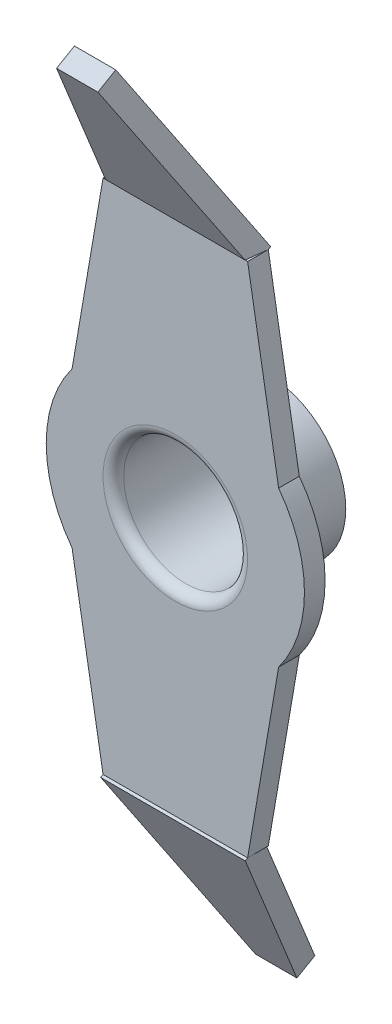
ISO-10303-21;
HEADER;
FILE_DESCRIPTION(('STEP AP214'),'2;1');
FILE_NAME('part.step','',(''),(''),'','','');
FILE_SCHEMA(('AUTOMOTIVE_DESIGN { 1 0 10303 214 1 1 1 1 }'));
ENDSEC;
DATA;
#1=APPLICATION_CONTEXT('core data for automotive mechanical design processes');
#2=APPLICATION_PROTOCOL_DEFINITION('international standard','automotive_design',2000,#1);
#3=PRODUCT_CONTEXT('',#1,'mechanical');
#4=PRODUCT('Part','Part','',(#3));
#5=PRODUCT_RELATED_PRODUCT_CATEGORY('part','',(#4));
#6=PRODUCT_DEFINITION_FORMATION('','',#4);
#7=PRODUCT_DEFINITION_CONTEXT('part definition',#1,'design');
#8=PRODUCT_DEFINITION('design','',#6,#7);
#9=PRODUCT_DEFINITION_SHAPE('','',#8);
#10=(LENGTH_UNIT() NAMED_UNIT(*) SI_UNIT(.MILLI.,.METRE.));
#11=(NAMED_UNIT(*) PLANE_ANGLE_UNIT() SI_UNIT($,.RADIAN.));
#12=(NAMED_UNIT(*) SI_UNIT($,.STERADIAN.) SOLID_ANGLE_UNIT());
#13=UNCERTAINTY_MEASURE_WITH_UNIT(LENGTH_MEASURE(1.E-05),#10,'distance_accuracy_value','');
#14=(GEOMETRIC_REPRESENTATION_CONTEXT(3) GLOBAL_UNCERTAINTY_ASSIGNED_CONTEXT((#13)) GLOBAL_UNIT_ASSIGNED_CONTEXT((#10,
#11,#12)) REPRESENTATION_CONTEXT('',''));
#15=CARTESIAN_POINT('',(0.,0.,0.));
#16=DIRECTION('',(0.,0.,1.));
#17=DIRECTION('',(1.,0.,0.));
#18=AXIS2_PLACEMENT_3D('',#15,#16,#17);
#19=CARTESIAN_POINT('',(-7.,-25.,9.));
#20=DIRECTION('',(0.,1.,0.));
#21=DIRECTION('',(0.,0.,1.));
#22=AXIS2_PLACEMENT_3D('',#19,#20,#21);
#23=PLANE('',#22);
#24=DIRECTION('',(0.124034734589208,0.,-0.992277876713668));
#25=VECTOR('',#24,1.);
#26=CARTESIAN_POINT('',(-7.00000000000001,-25.,9.));
#27=LINE('',#26,#25);
#28=CARTESIAN_POINT('',(-7.,-25.,9.));
#29=VERTEX_POINT('',#28);
#30=CARTESIAN_POINT('',(-6.75000000000001,-25.,7.));
#31=VERTEX_POINT('',#30);
#32=EDGE_CURVE('E11',#29,#31,#27,.T.);
#33=ORIENTED_EDGE('',*,*,#32,.F.);
#34=DIRECTION('',(0.,0.,-1.));
#35=VECTOR('',#34,1.);
#36=CARTESIAN_POINT('',(-7.,-25.,9.));
#37=LINE('',#36,#35);
#38=CARTESIAN_POINT('',(-7.,-25.,7.));
#39=VERTEX_POINT('',#38);
#40=EDGE_CURVE('E255',#29,#39,#37,.T.);
#41=ORIENTED_EDGE('',*,*,#40,.T.);
#42=DIRECTION('',(1.,0.,0.));
#43=VECTOR('',#42,1.);
#44=CARTESIAN_POINT('',(-7.,-25.,7.));
#45=LINE('',#44,#43);
#46=EDGE_CURVE('E208',#39,#31,#45,.T.);
#47=ORIENTED_EDGE('',*,*,#46,.T.);
#48=EDGE_LOOP('',(#33,#41,#47));
#49=FACE_BOUND('',#48,.T.);
#50=ADVANCED_FACE('F32',(#49),#23,.F.);
#51=DIRECTION('',(0.124034734589208,0.,0.992277876713668));
#52=VECTOR('',#51,1.);
#53=CARTESIAN_POINT('',(6.78461538461539,-25.,7.27692307692308));
#54=LINE('',#53,#52);
#55=CARTESIAN_POINT('',(6.75,-25.,6.99999999999999));
#56=VERTEX_POINT('',#55);
#57=CARTESIAN_POINT('',(7.,-25.,9.));
#58=VERTEX_POINT('',#57);
#59=EDGE_CURVE('E40',#56,#58,#54,.T.);
#60=ORIENTED_EDGE('',*,*,#59,.F.);
#61=CARTESIAN_POINT('',(6.99999999999999,-25.,7.));
#62=VERTEX_POINT('',#61);
#63=EDGE_CURVE('E207',#56,#62,#45,.T.);
#64=ORIENTED_EDGE('',*,*,#63,.T.);
#65=DIRECTION('',(0.,0.,-1.));
#66=VECTOR('',#65,1.);
#67=CARTESIAN_POINT('',(7.,-25.,9.));
#68=LINE('',#67,#66);
#69=EDGE_CURVE('E252',#58,#62,#68,.T.);
#70=ORIENTED_EDGE('',*,*,#69,.F.);
#71=EDGE_LOOP('',(#60,#64,#70));
#72=FACE_BOUND('',#71,.T.);
#73=ADVANCED_FACE('F317',(#72),#23,.F.);
#74=CARTESIAN_POINT('',(-7.,25.,9.));
#75=DIRECTION('',(0.,-1.,0.));
#76=DIRECTION('',(0.,0.,-1.));
#77=AXIS2_PLACEMENT_3D('',#74,#75,#76);
#78=PLANE('',#77);
#79=DIRECTION('',(0.124034734589208,0.,0.992277876713668));
#80=VECTOR('',#79,1.);
#81=CARTESIAN_POINT('',(-6.75384615384616,25.,8.96923076923076));
#82=LINE('',#81,#80);
#83=CARTESIAN_POINT('',(-7.,25.,7.00000000000002));
#84=VERTEX_POINT('',#83);
#85=CARTESIAN_POINT('',(-6.75,25.,9.));
#86=VERTEX_POINT('',#85);
#87=EDGE_CURVE('E281',#84,#86,#82,.T.);
#88=ORIENTED_EDGE('',*,*,#87,.F.);
#89=DIRECTION('',(0.,0.,-1.));
#90=VECTOR('',#89,1.);
#91=CARTESIAN_POINT('',(-7.,25.,9.));
#92=LINE('',#91,#90);
#93=CARTESIAN_POINT('',(-7.,25.,9.));
#94=VERTEX_POINT('',#93);
#95=EDGE_CURVE('E239',#94,#84,#92,.T.);
#96=ORIENTED_EDGE('',*,*,#95,.F.);
#97=DIRECTION('',(-1.,0.,0.));
#98=VECTOR('',#97,1.);
#99=CARTESIAN_POINT('',(-7.,25.,9.));
#100=LINE('',#99,#98);
#101=EDGE_CURVE('E235',#86,#94,#100,.T.);
#102=ORIENTED_EDGE('',*,*,#101,.F.);
#103=EDGE_LOOP('',(#88,#96,#102));
#104=FACE_BOUND('',#103,.T.);
#105=ADVANCED_FACE('F323',(#104),#78,.F.);
#106=DIRECTION('',(0.124034734589208,0.,-0.992277876713668));
#107=VECTOR('',#106,1.);
#108=CARTESIAN_POINT('',(6.53846153846154,25.,10.6923076923077));
#109=LINE('',#108,#107);
#110=CARTESIAN_POINT('',(6.75,25.,9.));
#111=VERTEX_POINT('',#110);
#112=CARTESIAN_POINT('',(7.,25.,7.));
#113=VERTEX_POINT('',#112);
#114=EDGE_CURVE('E279',#111,#113,#109,.T.);
#115=ORIENTED_EDGE('',*,*,#114,.F.);
#116=CARTESIAN_POINT('',(7.,25.,9.));
#117=VERTEX_POINT('',#116);
#118=EDGE_CURVE('E236',#117,#111,#100,.T.);
#119=ORIENTED_EDGE('',*,*,#118,.F.);
#120=DIRECTION('',(0.,0.,-1.));
#121=VECTOR('',#120,1.);
#122=CARTESIAN_POINT('',(7.,25.,9.));
#123=LINE('',#122,#121);
#124=EDGE_CURVE('E243',#117,#113,#123,.T.);
#125=ORIENTED_EDGE('',*,*,#124,.T.);
#126=EDGE_LOOP('',(#115,#119,#125));
#127=FACE_BOUND('',#126,.T.);
#128=ADVANCED_FACE('F347',(#127),#78,.F.);
#129=CARTESIAN_POINT('',(0.,0.,0.));
#130=DIRECTION('',(0.,0.,1.));
#131=DIRECTION('',(1.,0.,0.));
#132=AXIS2_PLACEMENT_3D('',#129,#130,#131);
#133=PLANE('',#132);
#134=CARTESIAN_POINT('',(0.,0.,0.));
#135=DIRECTION('',(0.,0.,1.));
#136=DIRECTION('',(1.,0.,0.));
#137=AXIS2_PLACEMENT_3D('',#134,#135,#136);
#138=CIRCLE('',#137,7.5);
#139=CARTESIAN_POINT('',(7.5,0.,0.));
#140=VERTEX_POINT('',#139);
#141=EDGE_CURVE('E267',#140,#140,#138,.T.);
#142=ORIENTED_EDGE('',*,*,#141,.F.);
#143=EDGE_LOOP('',(#142));
#144=FACE_BOUND('',#143,.T.);
#145=CARTESIAN_POINT('',(0.,0.,0.));
#146=DIRECTION('',(0.,0.,1.));
#147=DIRECTION('',(1.,0.,0.));
#148=AXIS2_PLACEMENT_3D('',#145,#146,#147);
#149=CIRCLE('',#148,6.);
#150=CARTESIAN_POINT('',(6.,0.,0.));
#151=VERTEX_POINT('',#150);
#152=EDGE_CURVE('E264',#151,#151,#149,.T.);
#153=ORIENTED_EDGE('',*,*,#152,.T.);
#154=EDGE_LOOP('',(#153));
#155=FACE_BOUND('',#154,.T.);
#156=ADVANCED_FACE('F345',(#144,#155),#133,.F.);
#157=CARTESIAN_POINT('',(0.,0.,6.99999999999999));
#158=DIRECTION('',(0.,0.,-1.));
#159=DIRECTION('',(-1.,0.,0.));
#160=AXIS2_PLACEMENT_3D('',#157,#158,#159);
#161=CYLINDRICAL_SURFACE('',#160,7.5);
#162=CARTESIAN_POINT('',(0.,0.,6.99999999999999));
#163=DIRECTION('',(0.,0.,1.));
#164=DIRECTION('',(1.,0.,0.));
#165=AXIS2_PLACEMENT_3D('',#162,#163,#164);
#166=CIRCLE('',#165,7.5);
#167=CARTESIAN_POINT('',(7.5,0.,6.99999999999999));
#168=VERTEX_POINT('',#167);
#169=EDGE_CURVE('E270',#168,#168,#166,.T.);
#170=ORIENTED_EDGE('',*,*,#169,.F.);
#171=EDGE_LOOP('',(#170));
#172=FACE_BOUND('',#171,.T.);
#173=ORIENTED_EDGE('',*,*,#141,.T.);
#174=EDGE_LOOP('',(#173));
#175=FACE_BOUND('',#174,.T.);
#176=ADVANCED_FACE('F34',(#172,#175),#161,.T.);
#177=CARTESIAN_POINT('',(0.,0.,6.99999999999999));
#178=DIRECTION('',(0.,0.,-1.));
#179=DIRECTION('',(-1.,0.,0.));
#180=AXIS2_PLACEMENT_3D('',#177,#178,#179);
#181=CYLINDRICAL_SURFACE('',#180,6.);
#182=CARTESIAN_POINT('',(0.,0.,7.99999999999999));
#183=DIRECTION('',(0.,0.,1.));
#184=DIRECTION('',(1.,0.,0.));
#185=AXIS2_PLACEMENT_3D('',#182,#183,#184);
#186=CIRCLE('',#185,6.);
#187=CARTESIAN_POINT('',(6.,0.,7.99999999999999));
#188=VERTEX_POINT('',#187);
#189=EDGE_CURVE('E273',#188,#188,#186,.T.);
#190=ORIENTED_EDGE('',*,*,#189,.T.);
#191=EDGE_LOOP('',(#190));
#192=FACE_BOUND('',#191,.T.);
#193=ORIENTED_EDGE('',*,*,#152,.F.);
#194=EDGE_LOOP('',(#193));
#195=FACE_BOUND('',#194,.T.);
#196=ADVANCED_FACE('F341',(#192,#195),#181,.F.);
#197=CARTESIAN_POINT('',(0.,0.,6.99999999999999));
#198=DIRECTION('',(0.,0.,1.));
#199=DIRECTION('',(1.,0.,0.));
#200=AXIS2_PLACEMENT_3D('',#197,#198,#199);
#201=PLANE('',#200);
#202=DIRECTION('',(-0.168963815110846,-0.985622254813266,0.));
#203=VECTOR('',#202,1.);
#204=CARTESIAN_POINT('',(-7.,25.,7.));
#205=LINE('',#204,#203);
#206=CARTESIAN_POINT('',(-9.99999999999999,7.5,7.));
#207=VERTEX_POINT('',#206);
#208=EDGE_CURVE('E200',#84,#207,#205,.T.);
#209=ORIENTED_EDGE('',*,*,#208,.F.);
#210=DIRECTION('',(-1.,0.,0.));
#211=VECTOR('',#210,1.);
#212=CARTESIAN_POINT('',(-7.,25.,7.));
#213=LINE('',#212,#211);
#214=EDGE_CURVE('E217',#113,#84,#213,.T.);
#215=ORIENTED_EDGE('',*,*,#214,.F.);
#216=DIRECTION('',(-0.168963815110846,0.985622254813266,0.));
#217=VECTOR('',#216,1.);
#218=CARTESIAN_POINT('',(7.,25.,7.));
#219=LINE('',#218,#217);
#220=CARTESIAN_POINT('',(10.,7.5,7.));
#221=VERTEX_POINT('',#220);
#222=EDGE_CURVE('E214',#221,#113,#219,.T.);
#223=ORIENTED_EDGE('',*,*,#222,.F.);
#224=CARTESIAN_POINT('',(0.,0.,6.99999999999999));
#225=DIRECTION('',(0.,0.,1.));
#226=DIRECTION('',(1.,0.,0.));
#227=AXIS2_PLACEMENT_3D('',#224,#225,#226);
#228=CIRCLE('',#227,12.5);
#229=CARTESIAN_POINT('',(10.,-7.5,7.));
#230=VERTEX_POINT('',#229);
#231=EDGE_CURVE('E212',#230,#221,#228,.T.);
#232=ORIENTED_EDGE('',*,*,#231,.F.);
#233=DIRECTION('',(0.168963815110846,0.985622254813266,0.));
#234=VECTOR('',#233,1.);
#235=CARTESIAN_POINT('',(6.99999999999999,-25.,7.));
#236=LINE('',#235,#234);
#237=EDGE_CURVE('E210',#62,#230,#236,.T.);
#238=ORIENTED_EDGE('',*,*,#237,.F.);
#239=ORIENTED_EDGE('',*,*,#63,.F.);
#240=EDGE_CURVE('E47',#31,#56,#45,.T.);
#241=ORIENTED_EDGE('',*,*,#240,.F.);
#242=ORIENTED_EDGE('',*,*,#46,.F.);
#243=DIRECTION('',(0.168963815110846,-0.985622254813267,0.));
#244=VECTOR('',#243,1.);
#245=CARTESIAN_POINT('',(-7.,-25.,7.));
#246=LINE('',#245,#244);
#247=CARTESIAN_POINT('',(-10.,-7.49999999999999,7.));
#248=VERTEX_POINT('',#247);
#249=EDGE_CURVE('E205',#248,#39,#246,.T.);
#250=ORIENTED_EDGE('',*,*,#249,.F.);
#251=CARTESIAN_POINT('',(0.,0.,6.99999999999999));
#252=DIRECTION('',(0.,0.,1.));
#253=DIRECTION('',(1.,0.,0.));
#254=AXIS2_PLACEMENT_3D('',#251,#252,#253);
#255=CIRCLE('',#254,12.5);
#256=EDGE_CURVE('E203',#207,#248,#255,.T.);
#257=ORIENTED_EDGE('',*,*,#256,.F.);
#258=EDGE_LOOP('',(#209,#215,#223,#232,#238,#239,#241,#242,#250,#257));
#259=FACE_BOUND('',#258,.T.);
#260=ORIENTED_EDGE('',*,*,#169,.T.);
#261=EDGE_LOOP('',(#260));
#262=FACE_BOUND('',#261,.T.);
#263=ADVANCED_FACE('F343',(#259,#262),#201,.F.);
#264=CARTESIAN_POINT('',(0.,0.,9.));
#265=DIRECTION('',(0.,0.,1.));
#266=DIRECTION('',(1.,0.,0.));
#267=AXIS2_PLACEMENT_3D('',#264,#265,#266);
#268=PLANE('',#267);
#269=CARTESIAN_POINT('',(0.,0.,9.));
#270=DIRECTION('',(0.,0.,1.));
#271=DIRECTION('',(1.,0.,0.));
#272=AXIS2_PLACEMENT_3D('',#269,#270,#271);
#273=CIRCLE('',#272,7.);
#274=CARTESIAN_POINT('',(7.,0.,9.));
#275=VERTEX_POINT('',#274);
#276=EDGE_CURVE('E276',#275,#275,#273,.F.);
#277=ORIENTED_EDGE('',*,*,#276,.T.);
#278=EDGE_LOOP('',(#277));
#279=FACE_BOUND('',#278,.T.);
#280=DIRECTION('',(-0.168963815110846,-0.985622254813266,0.));
#281=VECTOR('',#280,1.);
#282=CARTESIAN_POINT('',(-7.,25.,9.));
#283=LINE('',#282,#281);
#284=CARTESIAN_POINT('',(-10.,7.5,9.));
#285=VERTEX_POINT('',#284);
#286=EDGE_CURVE('E219',#94,#285,#283,.T.);
#287=ORIENTED_EDGE('',*,*,#286,.T.);
#288=CARTESIAN_POINT('',(0.,0.,9.));
#289=DIRECTION('',(0.,0.,1.));
#290=DIRECTION('',(1.,0.,0.));
#291=AXIS2_PLACEMENT_3D('',#288,#289,#290);
#292=CIRCLE('',#291,12.5);
#293=CARTESIAN_POINT('',(-10.,-7.5,9.));
#294=VERTEX_POINT('',#293);
#295=EDGE_CURVE('E222',#285,#294,#292,.T.);
#296=ORIENTED_EDGE('',*,*,#295,.T.);
#297=DIRECTION('',(0.168963815110846,-0.985622254813267,0.));
#298=VECTOR('',#297,1.);
#299=CARTESIAN_POINT('',(-7.,-25.,9.));
#300=LINE('',#299,#298);
#301=EDGE_CURVE('E224',#294,#29,#300,.T.);
#302=ORIENTED_EDGE('',*,*,#301,.T.);
#303=DIRECTION('',(1.,0.,0.));
#304=VECTOR('',#303,1.);
#305=CARTESIAN_POINT('',(-7.,-25.,9.));
#306=LINE('',#305,#304);
#307=EDGE_CURVE('E227',#29,#58,#306,.T.);
#308=ORIENTED_EDGE('',*,*,#307,.T.);
#309=DIRECTION('',(0.168963815110846,0.985622254813266,0.));
#310=VECTOR('',#309,1.);
#311=CARTESIAN_POINT('',(7.,-25.,9.));
#312=LINE('',#311,#310);
#313=CARTESIAN_POINT('',(9.99999999999999,-7.5,9.));
#314=VERTEX_POINT('',#313);
#315=EDGE_CURVE('E229',#58,#314,#312,.T.);
#316=ORIENTED_EDGE('',*,*,#315,.T.);
#317=CARTESIAN_POINT('',(0.,0.,9.));
#318=DIRECTION('',(0.,0.,1.));
#319=DIRECTION('',(1.,0.,0.));
#320=AXIS2_PLACEMENT_3D('',#317,#318,#319);
#321=CIRCLE('',#320,12.5);
#322=CARTESIAN_POINT('',(10.,7.49999999999999,9.));
#323=VERTEX_POINT('',#322);
#324=EDGE_CURVE('E231',#314,#323,#321,.T.);
#325=ORIENTED_EDGE('',*,*,#324,.T.);
#326=DIRECTION('',(-0.168963815110846,0.985622254813266,0.));
#327=VECTOR('',#326,1.);
#328=CARTESIAN_POINT('',(7.,25.,9.));
#329=LINE('',#328,#327);
#330=EDGE_CURVE('E233',#323,#117,#329,.T.);
#331=ORIENTED_EDGE('',*,*,#330,.T.);
#332=ORIENTED_EDGE('',*,*,#118,.T.);
#333=EDGE_CURVE('E240',#111,#86,#100,.T.);
#334=ORIENTED_EDGE('',*,*,#333,.T.);
#335=ORIENTED_EDGE('',*,*,#101,.T.);
#336=EDGE_LOOP('',(#287,#296,#302,#308,#316,#325,#331,#332,#334,#335));
#337=FACE_BOUND('',#336,.T.);
#338=ADVANCED_FACE('F339',(#279,#337),#268,.T.);
#339=CARTESIAN_POINT('',(-7.,25.,9.));
#340=DIRECTION('',(0.985622254813266,-0.168963815110846,0.));
#341=DIRECTION('',(0.168963815110846,0.985622254813266,0.));
#342=AXIS2_PLACEMENT_3D('',#339,#340,#341);
#343=PLANE('',#342);
#344=ORIENTED_EDGE('',*,*,#208,.T.);
#345=DIRECTION('',(0.,0.,-1.));
#346=VECTOR('',#345,1.);
#347=CARTESIAN_POINT('',(-10.,7.5,9.));
#348=LINE('',#347,#346);
#349=EDGE_CURVE('E261',#285,#207,#348,.T.);
#350=ORIENTED_EDGE('',*,*,#349,.F.);
#351=ORIENTED_EDGE('',*,*,#286,.F.);
#352=ORIENTED_EDGE('',*,*,#95,.T.);
#353=EDGE_LOOP('',(#344,#350,#351,#352));
#354=FACE_BOUND('',#353,.T.);
#355=ADVANCED_FACE('F335',(#354),#343,.F.);
#356=CARTESIAN_POINT('',(0.,0.,9.));
#357=DIRECTION('',(0.,0.,-1.));
#358=DIRECTION('',(-1.,0.,0.));
#359=AXIS2_PLACEMENT_3D('',#356,#357,#358);
#360=CYLINDRICAL_SURFACE('',#359,12.5);
#361=ORIENTED_EDGE('',*,*,#256,.T.);
#362=DIRECTION('',(0.,0.,-1.));
#363=VECTOR('',#362,1.);
#364=CARTESIAN_POINT('',(-10.,-7.5,9.));
#365=LINE('',#364,#363);
#366=EDGE_CURVE('E258',#294,#248,#365,.T.);
#367=ORIENTED_EDGE('',*,*,#366,.F.);
#368=ORIENTED_EDGE('',*,*,#295,.F.);
#369=ORIENTED_EDGE('',*,*,#349,.T.);
#370=EDGE_LOOP('',(#361,#367,#368,#369));
#371=FACE_BOUND('',#370,.T.);
#372=ADVANCED_FACE('F331',(#371),#360,.T.);
#373=CARTESIAN_POINT('',(-7.,-25.,9.));
#374=DIRECTION('',(0.985622254813267,0.168963815110846,0.));
#375=DIRECTION('',(-0.168963815110846,0.985622254813267,0.));
#376=AXIS2_PLACEMENT_3D('',#373,#374,#375);
#377=PLANE('',#376);
#378=ORIENTED_EDGE('',*,*,#249,.T.);
#379=ORIENTED_EDGE('',*,*,#40,.F.);
#380=ORIENTED_EDGE('',*,*,#301,.F.);
#381=ORIENTED_EDGE('',*,*,#366,.T.);
#382=EDGE_LOOP('',(#378,#379,#380,#381));
#383=FACE_BOUND('',#382,.T.);
#384=ADVANCED_FACE('F328',(#383),#377,.F.);
#385=CARTESIAN_POINT('',(7.,-25.,9.));
#386=DIRECTION('',(-0.985622254813266,0.168963815110846,0.));
#387=DIRECTION('',(-0.168963815110846,-0.985622254813266,0.));
#388=AXIS2_PLACEMENT_3D('',#385,#386,#387);
#389=PLANE('',#388);
#390=ORIENTED_EDGE('',*,*,#237,.T.);
#391=DIRECTION('',(0.,0.,-1.));
#392=VECTOR('',#391,1.);
#393=CARTESIAN_POINT('',(9.99999999999999,-7.5,9.));
#394=LINE('',#393,#392);
#395=EDGE_CURVE('E249',#314,#230,#394,.T.);
#396=ORIENTED_EDGE('',*,*,#395,.F.);
#397=ORIENTED_EDGE('',*,*,#315,.F.);
#398=ORIENTED_EDGE('',*,*,#69,.T.);
#399=EDGE_LOOP('',(#390,#396,#397,#398));
#400=FACE_BOUND('',#399,.T.);
#401=ADVANCED_FACE('F326',(#400),#389,.F.);
#402=CARTESIAN_POINT('',(0.,0.,9.));
#403=DIRECTION('',(0.,0.,-1.));
#404=DIRECTION('',(-1.,0.,0.));
#405=AXIS2_PLACEMENT_3D('',#402,#403,#404);
#406=CYLINDRICAL_SURFACE('',#405,12.5);
#407=ORIENTED_EDGE('',*,*,#231,.T.);
#408=DIRECTION('',(0.,0.,-1.));
#409=VECTOR('',#408,1.);
#410=CARTESIAN_POINT('',(10.,7.49999999999999,9.));
#411=LINE('',#410,#409);
#412=EDGE_CURVE('E246',#323,#221,#411,.T.);
#413=ORIENTED_EDGE('',*,*,#412,.F.);
#414=ORIENTED_EDGE('',*,*,#324,.F.);
#415=ORIENTED_EDGE('',*,*,#395,.T.);
#416=EDGE_LOOP('',(#407,#413,#414,#415));
#417=FACE_BOUND('',#416,.T.);
#418=ADVANCED_FACE('F372',(#417),#406,.T.);
#419=CARTESIAN_POINT('',(7.,25.,9.));
#420=DIRECTION('',(-0.985622254813266,-0.168963815110846,0.));
#421=DIRECTION('',(0.168963815110846,-0.985622254813266,0.));
#422=AXIS2_PLACEMENT_3D('',#419,#420,#421);
#423=PLANE('',#422);
#424=ORIENTED_EDGE('',*,*,#222,.T.);
#425=ORIENTED_EDGE('',*,*,#124,.F.);
#426=ORIENTED_EDGE('',*,*,#330,.F.);
#427=ORIENTED_EDGE('',*,*,#412,.T.);
#428=EDGE_LOOP('',(#424,#425,#426,#427));
#429=FACE_BOUND('',#428,.T.);
#430=ADVANCED_FACE('F369',(#429),#423,.F.);
#431=CARTESIAN_POINT('',(0.,0.,7.99999999999999));
#432=DIRECTION('',(0.,0.,1.));
#433=DIRECTION('',(1.,0.,0.));
#434=AXIS2_PLACEMENT_3D('',#431,#432,#433);
#435=TOROIDAL_SURFACE('',#434,7.,1.);
#436=ORIENTED_EDGE('',*,*,#276,.F.);
#437=EDGE_LOOP('',(#436));
#438=FACE_BOUND('',#437,.T.);
#439=ORIENTED_EDGE('',*,*,#189,.F.);
#440=EDGE_LOOP('',(#439));
#441=FACE_BOUND('',#440,.T.);
#442=ADVANCED_FACE('F371',(#438,#441),#435,.T.);
#443=CARTESIAN_POINT('',(7.,25.1339745962156,6.76794919243113));
#444=DIRECTION('',(0.,0.86602540378444,0.499999999999998));
#445=DIRECTION('',(0.,-0.499999999999998,0.86602540378444));
#446=AXIS2_PLACEMENT_3D('',#443,#444,#445);
#447=PLANE('',#446);
#448=DIRECTION('',(0.,-0.499999999999998,0.86602540378444));
#449=VECTOR('',#448,1.);
#450=CARTESIAN_POINT('',(7.,25.1339745962156,6.76794919243113));
#451=LINE('',#450,#449);
#452=CARTESIAN_POINT('',(7.,25.1339745962156,6.76794919243113));
#453=VERTEX_POINT('',#452);
#454=EDGE_CURVE('E188',#453,#113,#451,.T.);
#455=ORIENTED_EDGE('',*,*,#454,.T.);
#456=ORIENTED_EDGE('',*,*,#214,.T.);
#457=DIRECTION('',(0.,-0.499999999999998,0.86602540378444));
#458=VECTOR('',#457,1.);
#459=CARTESIAN_POINT('',(-7.,25.1339745962156,6.76794919243113));
#460=LINE('',#459,#458);
#461=CARTESIAN_POINT('',(-7.,25.1339745962156,6.76794919243113));
#462=VERTEX_POINT('',#461);
#463=EDGE_CURVE('E197',#462,#84,#460,.T.);
#464=ORIENTED_EDGE('',*,*,#463,.F.);
#465=DIRECTION('',(-1.,0.,0.));
#466=VECTOR('',#465,1.);
#467=CARTESIAN_POINT('',(7.,25.1339745962156,6.76794919243113));
#468=LINE('',#467,#466);
#469=EDGE_CURVE('E179',#453,#462,#468,.T.);
#470=ORIENTED_EDGE('',*,*,#469,.F.);
#471=EDGE_LOOP('',(#455,#456,#464,#470));
#472=FACE_BOUND('',#471,.T.);
#473=ADVANCED_FACE('F393',(#472),#447,.F.);
#474=CARTESIAN_POINT('',(-7.,25.1339745962156,6.76794919243113));
#475=DIRECTION('',(0.970142500145332,-0.210042012604202,-0.121267812518166));
#476=DIRECTION('',(0.21160368475758,0.977355554850442,0.));
#477=AXIS2_PLACEMENT_3D('',#474,#475,#476);
#478=PLANE('',#477);
#479=ORIENTED_EDGE('',*,*,#463,.T.);
#480=ORIENTED_EDGE('',*,*,#87,.T.);
#481=DIRECTION('',(0.242535625036333,0.840168050416807,0.485071250072664));
#482=VECTOR('',#481,1.);
#483=CARTESIAN_POINT('',(-7.,24.1339745962156,8.50000000000001));
#484=LINE('',#483,#482);
#485=CARTESIAN_POINT('',(-2.,41.4544826719044,18.5));
#486=VERTEX_POINT('',#485);
#487=EDGE_CURVE('E55',#86,#486,#484,.T.);
#488=ORIENTED_EDGE('',*,*,#487,.T.);
#489=DIRECTION('',(0.,-0.499999999999998,0.86602540378444));
#490=VECTOR('',#489,1.);
#491=CARTESIAN_POINT('',(-2.,42.4544826719044,16.7679491924311));
#492=LINE('',#491,#490);
#493=CARTESIAN_POINT('',(-2.,42.4544826719044,16.7679491924311));
#494=VERTEX_POINT('',#493);
#495=EDGE_CURVE('E194',#494,#486,#492,.T.);
#496=ORIENTED_EDGE('',*,*,#495,.F.);
#497=DIRECTION('',(0.242535625036333,0.840168050416807,0.485071250072664));
#498=VECTOR('',#497,1.);
#499=CARTESIAN_POINT('',(-7.,25.1339745962156,6.76794919243113));
#500=LINE('',#499,#498);
#501=EDGE_CURVE('E182',#462,#494,#500,.T.);
#502=ORIENTED_EDGE('',*,*,#501,.F.);
#503=EDGE_LOOP('',(#479,#480,#488,#496,#502));
#504=FACE_BOUND('',#503,.T.);
#505=ADVANCED_FACE('F398',(#504),#478,.F.);
#506=CARTESIAN_POINT('',(7.,25.1339745962156,6.76794919243113));
#507=DIRECTION('',(-0.970142500145332,-0.210042012604201,-0.121267812518166));
#508=DIRECTION('',(0.21160368475758,-0.977355554850441,0.));
#509=AXIS2_PLACEMENT_3D('',#506,#507,#508);
#510=PLANE('',#509);
#511=DIRECTION('',(0.242535625036333,-0.840168050416807,-0.485071250072664));
#512=VECTOR('',#511,1.);
#513=CARTESIAN_POINT('',(7.,24.1339745962156,8.5));
#514=LINE('',#513,#512);
#515=CARTESIAN_POINT('',(2.,41.4544826719043,18.5));
#516=VERTEX_POINT('',#515);
#517=EDGE_CURVE('E176',#516,#111,#514,.T.);
#518=ORIENTED_EDGE('',*,*,#517,.T.);
#519=ORIENTED_EDGE('',*,*,#114,.T.);
#520=ORIENTED_EDGE('',*,*,#454,.F.);
#521=DIRECTION('',(0.242535625036333,-0.840168050416807,-0.485071250072664));
#522=VECTOR('',#521,1.);
#523=CARTESIAN_POINT('',(7.,25.1339745962156,6.76794919243113));
#524=LINE('',#523,#522);
#525=CARTESIAN_POINT('',(2.,42.4544826719043,16.7679491924311));
#526=VERTEX_POINT('',#525);
#527=EDGE_CURVE('E186',#526,#453,#524,.T.);
#528=ORIENTED_EDGE('',*,*,#527,.F.);
#529=DIRECTION('',(0.,-0.499999999999998,0.86602540378444));
#530=VECTOR('',#529,1.);
#531=CARTESIAN_POINT('',(2.,42.4544826719043,16.7679491924311));
#532=LINE('',#531,#530);
#533=EDGE_CURVE('E191',#526,#516,#532,.T.);
#534=ORIENTED_EDGE('',*,*,#533,.T.);
#535=EDGE_LOOP('',(#518,#519,#520,#528,#534));
#536=FACE_BOUND('',#535,.T.);
#537=ADVANCED_FACE('F411',(#536),#510,.F.);
#538=CARTESIAN_POINT('',(-7.,24.1339745962156,8.50000000000001));
#539=DIRECTION('',(0.,0.499999999999998,-0.86602540378444));
#540=DIRECTION('',(0.,0.86602540378444,0.499999999999998));
#541=AXIS2_PLACEMENT_3D('',#538,#539,#540);
#542=PLANE('',#541);
#543=ORIENTED_EDGE('',*,*,#487,.F.);
#544=ORIENTED_EDGE('',*,*,#333,.F.);
#545=ORIENTED_EDGE('',*,*,#517,.F.);
#546=DIRECTION('',(1.,0.,0.));
#547=VECTOR('',#546,1.);
#548=CARTESIAN_POINT('',(2.,41.4544826719043,18.5));
#549=LINE('',#548,#547);
#550=EDGE_CURVE('E169',#486,#516,#549,.T.);
#551=ORIENTED_EDGE('',*,*,#550,.F.);
#552=EDGE_LOOP('',(#543,#544,#545,#551));
#553=FACE_BOUND('',#552,.T.);
#554=ADVANCED_FACE('F409',(#553),#542,.F.);
#555=CARTESIAN_POINT('',(2.,42.4544826719043,16.7679491924311));
#556=DIRECTION('',(0.,-0.86602540378444,-0.499999999999998));
#557=DIRECTION('',(0.,0.499999999999998,-0.86602540378444));
#558=AXIS2_PLACEMENT_3D('',#555,#556,#557);
#559=PLANE('',#558);
#560=ORIENTED_EDGE('',*,*,#550,.T.);
#561=ORIENTED_EDGE('',*,*,#533,.F.);
#562=DIRECTION('',(1.,0.,0.));
#563=VECTOR('',#562,1.);
#564=CARTESIAN_POINT('',(2.,42.4544826719043,16.7679491924311));
#565=LINE('',#564,#563);
#566=EDGE_CURVE('E184',#494,#526,#565,.T.);
#567=ORIENTED_EDGE('',*,*,#566,.F.);
#568=ORIENTED_EDGE('',*,*,#495,.T.);
#569=EDGE_LOOP('',(#560,#561,#567,#568));
#570=FACE_BOUND('',#569,.T.);
#571=ADVANCED_FACE('F416',(#570),#559,.F.);
#572=CARTESIAN_POINT('',(-7.,25.1339745962156,6.76794919243113));
#573=DIRECTION('',(0.,0.499999999999998,-0.86602540378444));
#574=DIRECTION('',(0.,0.86602540378444,0.499999999999998));
#575=AXIS2_PLACEMENT_3D('',#572,#573,#574);
#576=PLANE('',#575);
#577=ORIENTED_EDGE('',*,*,#469,.T.);
#578=ORIENTED_EDGE('',*,*,#501,.T.);
#579=ORIENTED_EDGE('',*,*,#566,.T.);
#580=ORIENTED_EDGE('',*,*,#527,.T.);
#581=EDGE_LOOP('',(#577,#578,#579,#580));
#582=FACE_BOUND('',#581,.T.);
#583=ADVANCED_FACE('F418',(#582),#576,.T.);
#584=CARTESIAN_POINT('',(-7.,-25.1339745962156,9.23205080756887));
#585=DIRECTION('',(0.970142500145332,0.210042012604202,0.121267812518166));
#586=DIRECTION('',(-0.21160368475758,0.977355554850441,0.));
#587=AXIS2_PLACEMENT_3D('',#584,#585,#586);
#588=PLANE('',#587);
#589=DIRECTION('',(0.,0.499999999999998,-0.86602540378444));
#590=VECTOR('',#589,1.);
#591=CARTESIAN_POINT('',(-7.,-25.1339745962156,9.23205080756887));
#592=LINE('',#591,#590);
#593=CARTESIAN_POINT('',(-7.,-25.1339745962156,9.23205080756887));
#594=VERTEX_POINT('',#593);
#595=EDGE_CURVE('E297',#594,#29,#592,.T.);
#596=ORIENTED_EDGE('',*,*,#595,.T.);
#597=ORIENTED_EDGE('',*,*,#32,.T.);
#598=DIRECTION('',(0.242535625036333,-0.840168050416807,-0.485071250072664));
#599=VECTOR('',#598,1.);
#600=CARTESIAN_POINT('',(-7.,-24.1339745962156,7.49999999999999));
#601=LINE('',#600,#599);
#602=CARTESIAN_POINT('',(-2.,-41.4544826719044,-2.49999999999997));
#603=VERTEX_POINT('',#602);
#604=EDGE_CURVE('E146',#31,#603,#601,.T.);
#605=ORIENTED_EDGE('',*,*,#604,.T.);
#606=DIRECTION('',(0.,0.499999999999998,-0.86602540378444));
#607=VECTOR('',#606,1.);
#608=CARTESIAN_POINT('',(-2.,-42.4544826719044,-0.767949192431099));
#609=LINE('',#608,#607);
#610=CARTESIAN_POINT('',(-2.,-42.4544826719044,-0.767949192431099));
#611=VERTEX_POINT('',#610);
#612=EDGE_CURVE('E152',#611,#603,#609,.T.);
#613=ORIENTED_EDGE('',*,*,#612,.F.);
#614=DIRECTION('',(0.242535625036333,-0.840168050416807,-0.485071250072664));
#615=VECTOR('',#614,1.);
#616=CARTESIAN_POINT('',(-7.,-25.1339745962156,9.23205080756887));
#617=LINE('',#616,#615);
#618=EDGE_CURVE('E304',#594,#611,#617,.T.);
#619=ORIENTED_EDGE('',*,*,#618,.F.);
#620=EDGE_LOOP('',(#596,#597,#605,#613,#619));
#621=FACE_BOUND('',#620,.T.);
#622=ADVANCED_FACE('F149',(#621),#588,.F.);
#623=CARTESIAN_POINT('',(7.,-25.1339745962156,9.23205080756887));
#624=DIRECTION('',(-0.970142500145332,0.210042012604202,0.121267812518166));
#625=DIRECTION('',(-0.21160368475758,-0.977355554850442,0.));
#626=AXIS2_PLACEMENT_3D('',#623,#624,#625);
#627=PLANE('',#626);
#628=DIRECTION('',(0.242535625036333,0.840168050416807,0.485071250072664));
#629=VECTOR('',#628,1.);
#630=CARTESIAN_POINT('',(7.,-24.1339745962156,7.5));
#631=LINE('',#630,#629);
#632=CARTESIAN_POINT('',(2.,-41.4544826719044,-2.49999999999997));
#633=VERTEX_POINT('',#632);
#634=EDGE_CURVE('E159',#633,#56,#631,.T.);
#635=ORIENTED_EDGE('',*,*,#634,.T.);
#636=ORIENTED_EDGE('',*,*,#59,.T.);
#637=DIRECTION('',(0.,0.499999999999998,-0.86602540378444));
#638=VECTOR('',#637,1.);
#639=CARTESIAN_POINT('',(7.,-25.1339745962156,9.23205080756887));
#640=LINE('',#639,#638);
#641=CARTESIAN_POINT('',(7.,-25.1339745962156,9.23205080756887));
#642=VERTEX_POINT('',#641);
#643=EDGE_CURVE('E171',#642,#58,#640,.T.);
#644=ORIENTED_EDGE('',*,*,#643,.F.);
#645=DIRECTION('',(0.242535625036333,0.840168050416807,0.485071250072664));
#646=VECTOR('',#645,1.);
#647=CARTESIAN_POINT('',(7.,-25.1339745962156,9.23205080756887));
#648=LINE('',#647,#646);
#649=CARTESIAN_POINT('',(2.,-42.4544826719043,-0.767949192431082));
#650=VERTEX_POINT('',#649);
#651=EDGE_CURVE('E301',#650,#642,#648,.T.);
#652=ORIENTED_EDGE('',*,*,#651,.F.);
#653=DIRECTION('',(0.,0.499999999999998,-0.86602540378444));
#654=VECTOR('',#653,1.);
#655=CARTESIAN_POINT('',(2.,-42.4544826719043,-0.767949192431082));
#656=LINE('',#655,#654);
#657=EDGE_CURVE('E167',#650,#633,#656,.T.);
#658=ORIENTED_EDGE('',*,*,#657,.T.);
#659=EDGE_LOOP('',(#635,#636,#644,#652,#658));
#660=FACE_BOUND('',#659,.T.);
#661=ADVANCED_FACE('F287',(#660),#627,.F.);
#662=CARTESIAN_POINT('',(-7.,-25.1339745962156,9.23205080756887));
#663=DIRECTION('',(0.,-0.86602540378444,-0.499999999999998));
#664=DIRECTION('',(0.,0.499999999999998,-0.86602540378444));
#665=AXIS2_PLACEMENT_3D('',#662,#663,#664);
#666=PLANE('',#665);
#667=ORIENTED_EDGE('',*,*,#643,.T.);
#668=ORIENTED_EDGE('',*,*,#307,.F.);
#669=ORIENTED_EDGE('',*,*,#595,.F.);
#670=DIRECTION('',(-1.,0.,0.));
#671=VECTOR('',#670,1.);
#672=CARTESIAN_POINT('',(-7.,-25.1339745962156,9.23205080756887));
#673=LINE('',#672,#671);
#674=EDGE_CURVE('E296',#642,#594,#673,.T.);
#675=ORIENTED_EDGE('',*,*,#674,.F.);
#676=EDGE_LOOP('',(#667,#668,#669,#675));
#677=FACE_BOUND('',#676,.T.);
#678=ADVANCED_FACE('F294',(#677),#666,.F.);
#679=CARTESIAN_POINT('',(-2.,-41.4544826719044,-2.49999999999997));
#680=DIRECTION('',(0.,-0.499999999999998,0.86602540378444));
#681=DIRECTION('',(0.,-0.86602540378444,-0.499999999999998));
#682=AXIS2_PLACEMENT_3D('',#679,#680,#681);
#683=PLANE('',#682);
#684=ORIENTED_EDGE('',*,*,#604,.F.);
#685=ORIENTED_EDGE('',*,*,#240,.T.);
#686=ORIENTED_EDGE('',*,*,#634,.F.);
#687=DIRECTION('',(1.,0.,0.));
#688=VECTOR('',#687,1.);
#689=CARTESIAN_POINT('',(-2.,-41.4544826719044,-2.49999999999997));
#690=LINE('',#689,#688);
#691=EDGE_CURVE('E154',#603,#633,#690,.T.);
#692=ORIENTED_EDGE('',*,*,#691,.F.);
#693=EDGE_LOOP('',(#684,#685,#686,#692));
#694=FACE_BOUND('',#693,.T.);
#695=ADVANCED_FACE('F157',(#694),#683,.F.);
#696=CARTESIAN_POINT('',(-2.,-42.4544826719044,-0.767949192431099));
#697=DIRECTION('',(0.,0.86602540378444,0.499999999999998));
#698=DIRECTION('',(0.,-0.499999999999998,0.86602540378444));
#699=AXIS2_PLACEMENT_3D('',#696,#697,#698);
#700=PLANE('',#699);
#701=ORIENTED_EDGE('',*,*,#691,.T.);
#702=ORIENTED_EDGE('',*,*,#657,.F.);
#703=DIRECTION('',(1.,0.,0.));
#704=VECTOR('',#703,1.);
#705=CARTESIAN_POINT('',(-2.,-42.4544826719044,-0.767949192431099));
#706=LINE('',#705,#704);
#707=EDGE_CURVE('E165',#611,#650,#706,.T.);
#708=ORIENTED_EDGE('',*,*,#707,.F.);
#709=ORIENTED_EDGE('',*,*,#612,.T.);
#710=EDGE_LOOP('',(#701,#702,#708,#709));
#711=FACE_BOUND('',#710,.T.);
#712=ADVANCED_FACE('F164',(#711),#700,.F.);
#713=CARTESIAN_POINT('',(-2.,-42.4544826719044,-0.767949192431099));
#714=DIRECTION('',(0.,-0.499999999999998,0.86602540378444));
#715=DIRECTION('',(0.,-0.86602540378444,-0.499999999999998));
#716=AXIS2_PLACEMENT_3D('',#713,#714,#715);
#717=PLANE('',#716);
#718=ORIENTED_EDGE('',*,*,#618,.T.);
#719=ORIENTED_EDGE('',*,*,#707,.T.);
#720=ORIENTED_EDGE('',*,*,#651,.T.);
#721=ORIENTED_EDGE('',*,*,#674,.T.);
#722=EDGE_LOOP('',(#718,#719,#720,#721));
#723=FACE_BOUND('',#722,.T.);
#724=ADVANCED_FACE('F307',(#723),#717,.T.);
#725=CLOSED_SHELL('',(#50,#73,#105,#128,#156,#176,#196,#263,#338,#355,#372,#384,#401,#418,#430,
#442,#473,#505,#537,#554,#571,#583,#622,#661,#678,#695,#712,#724));
#726=MANIFOLD_SOLID_BREP('B2',#725);
#727=ADVANCED_BREP_SHAPE_REPRESENTATION('',(#18,#726),#14);
#728=SHAPE_DEFINITION_REPRESENTATION(#9,#727);
ENDSEC;
END-ISO-10303-21;
